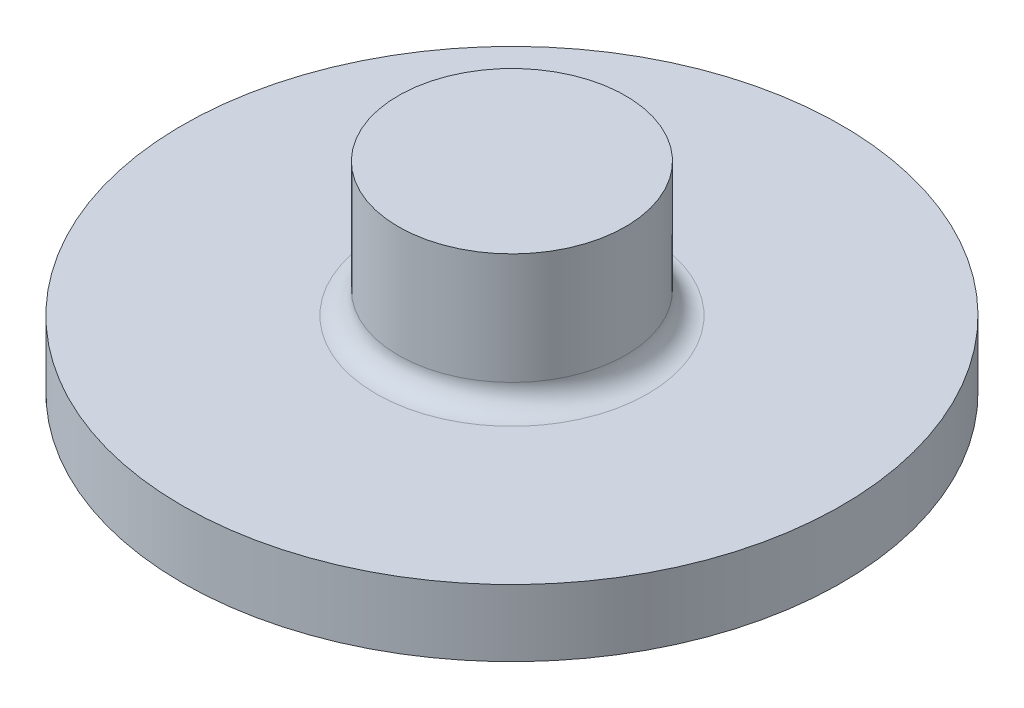
ISO-10303-21;
HEADER;
FILE_DESCRIPTION(('STEP AP214'),'2;1');
FILE_NAME('part.step','',(''),(''),'','','');
FILE_SCHEMA(('AUTOMOTIVE_DESIGN { 1 0 10303 214 1 1 1 1 }'));
ENDSEC;
DATA;
#1=APPLICATION_CONTEXT('core data for automotive mechanical design processes');
#2=APPLICATION_PROTOCOL_DEFINITION('international standard','automotive_design',2000,#1);
#3=PRODUCT_CONTEXT('',#1,'mechanical');
#4=PRODUCT('Part','Part','',(#3));
#5=PRODUCT_RELATED_PRODUCT_CATEGORY('part','',(#4));
#6=PRODUCT_DEFINITION_FORMATION('','',#4);
#7=PRODUCT_DEFINITION_CONTEXT('part definition',#1,'design');
#8=PRODUCT_DEFINITION('design','',#6,#7);
#9=PRODUCT_DEFINITION_SHAPE('','',#8);
#10=(LENGTH_UNIT() NAMED_UNIT(*) SI_UNIT(.MILLI.,.METRE.));
#11=(NAMED_UNIT(*) PLANE_ANGLE_UNIT() SI_UNIT($,.RADIAN.));
#12=(NAMED_UNIT(*) SI_UNIT($,.STERADIAN.) SOLID_ANGLE_UNIT());
#13=UNCERTAINTY_MEASURE_WITH_UNIT(LENGTH_MEASURE(1.E-05),#10,'distance_accuracy_value','');
#14=(GEOMETRIC_REPRESENTATION_CONTEXT(3) GLOBAL_UNCERTAINTY_ASSIGNED_CONTEXT((#13)) GLOBAL_UNIT_ASSIGNED_CONTEXT((#10,
#11,#12)) REPRESENTATION_CONTEXT('',''));
#15=CARTESIAN_POINT('',(0.,0.,0.));
#16=DIRECTION('',(0.,0.,1.));
#17=DIRECTION('',(1.,0.,0.));
#18=AXIS2_PLACEMENT_3D('',#15,#16,#17);
#19=CARTESIAN_POINT('',(0.,1.5,0.));
#20=DIRECTION('',(0.,-1.,0.));
#21=DIRECTION('',(0.,0.,-1.));
#22=AXIS2_PLACEMENT_3D('',#19,#20,#21);
#23=CYLINDRICAL_SURFACE('',#22,7.4);
#24=CARTESIAN_POINT('',(0.,1.5,0.));
#25=DIRECTION('',(0.,1.,0.));
#26=DIRECTION('',(0.,0.,1.));
#27=AXIS2_PLACEMENT_3D('',#24,#25,#26);
#28=CIRCLE('',#27,7.4);
#29=CARTESIAN_POINT('',(0.,1.5,7.4));
#30=VERTEX_POINT('',#29);
#31=EDGE_CURVE('E50',#30,#30,#28,.T.);
#32=ORIENTED_EDGE('',*,*,#31,.F.);
#33=EDGE_LOOP('',(#32));
#34=FACE_BOUND('',#33,.T.);
#35=CARTESIAN_POINT('',(0.,0.,0.));
#36=DIRECTION('',(0.,1.,0.));
#37=DIRECTION('',(0.,0.,1.));
#38=AXIS2_PLACEMENT_3D('',#35,#36,#37);
#39=CIRCLE('',#38,7.4);
#40=CARTESIAN_POINT('',(0.,0.,7.4));
#41=VERTEX_POINT('',#40);
#42=EDGE_CURVE('E55',#41,#41,#39,.T.);
#43=ORIENTED_EDGE('',*,*,#42,.T.);
#44=EDGE_LOOP('',(#43));
#45=FACE_BOUND('',#44,.T.);
#46=ADVANCED_FACE('F37',(#34,#45),#23,.T.);
#47=CARTESIAN_POINT('',(0.,1.5,0.));
#48=DIRECTION('',(0.,1.,0.));
#49=DIRECTION('',(0.,0.,1.));
#50=AXIS2_PLACEMENT_3D('',#47,#48,#49);
#51=PLANE('',#50);
#52=CARTESIAN_POINT('',(0.,1.5,0.));
#53=DIRECTION('',(0.,1.,0.));
#54=DIRECTION('',(0.,0.,1.));
#55=AXIS2_PLACEMENT_3D('',#52,#53,#54);
#56=CIRCLE('',#55,3.05);
#57=CARTESIAN_POINT('',(0.,1.5,3.05));
#58=VERTEX_POINT('',#57);
#59=EDGE_CURVE('E10',#58,#58,#56,.F.);
#60=ORIENTED_EDGE('',*,*,#59,.T.);
#61=EDGE_LOOP('',(#60));
#62=FACE_BOUND('',#61,.T.);
#63=ORIENTED_EDGE('',*,*,#31,.T.);
#64=EDGE_LOOP('',(#63));
#65=FACE_BOUND('',#64,.T.);
#66=ADVANCED_FACE('F77',(#62,#65),#51,.T.);
#67=CARTESIAN_POINT('',(0.,0.,0.));
#68=DIRECTION('',(0.,1.,0.));
#69=DIRECTION('',(0.,0.,1.));
#70=AXIS2_PLACEMENT_3D('',#67,#68,#69);
#71=PLANE('',#70);
#72=ORIENTED_EDGE('',*,*,#42,.F.);
#73=EDGE_LOOP('',(#72));
#74=FACE_BOUND('',#73,.T.);
#75=ADVANCED_FACE('F70',(#74),#71,.F.);
#76=CARTESIAN_POINT('',(0.,4.5,0.));
#77=DIRECTION('',(0.,-1.,0.));
#78=DIRECTION('',(0.,0.,-1.));
#79=AXIS2_PLACEMENT_3D('',#76,#77,#78);
#80=CYLINDRICAL_SURFACE('',#79,2.55);
#81=CARTESIAN_POINT('',(0.,2.,0.));
#82=DIRECTION('',(0.,1.,0.));
#83=DIRECTION('',(0.,0.,1.));
#84=AXIS2_PLACEMENT_3D('',#81,#82,#83);
#85=CIRCLE('',#84,2.55);
#86=CARTESIAN_POINT('',(0.,2.,2.55));
#87=VERTEX_POINT('',#86);
#88=EDGE_CURVE('E45',#87,#87,#85,.T.);
#89=ORIENTED_EDGE('',*,*,#88,.T.);
#90=EDGE_LOOP('',(#89));
#91=FACE_BOUND('',#90,.T.);
#92=CARTESIAN_POINT('',(0.,4.5,0.));
#93=DIRECTION('',(0.,1.,0.));
#94=DIRECTION('',(0.,0.,1.));
#95=AXIS2_PLACEMENT_3D('',#92,#93,#94);
#96=CIRCLE('',#95,2.55);
#97=CARTESIAN_POINT('',(0.,4.5,2.55));
#98=VERTEX_POINT('',#97);
#99=EDGE_CURVE('E60',#98,#98,#96,.T.);
#100=ORIENTED_EDGE('',*,*,#99,.F.);
#101=EDGE_LOOP('',(#100));
#102=FACE_BOUND('',#101,.T.);
#103=ADVANCED_FACE('F68',(#91,#102),#80,.T.);
#104=CARTESIAN_POINT('',(0.,4.5,0.));
#105=DIRECTION('',(0.,1.,0.));
#106=DIRECTION('',(0.,0.,1.));
#107=AXIS2_PLACEMENT_3D('',#104,#105,#106);
#108=PLANE('',#107);
#109=ORIENTED_EDGE('',*,*,#99,.T.);
#110=EDGE_LOOP('',(#109));
#111=FACE_BOUND('',#110,.T.);
#112=ADVANCED_FACE('F66',(#111),#108,.T.);
#113=CARTESIAN_POINT('',(0.,2.,0.));
#114=DIRECTION('',(0.,1.,0.));
#115=DIRECTION('',(0.,0.,1.));
#116=AXIS2_PLACEMENT_3D('',#113,#114,#115);
#117=TOROIDAL_SURFACE('',#116,3.05,0.5);
#118=ORIENTED_EDGE('',*,*,#59,.F.);
#119=EDGE_LOOP('',(#118));
#120=FACE_BOUND('',#119,.T.);
#121=ORIENTED_EDGE('',*,*,#88,.F.);
#122=EDGE_LOOP('',(#121));
#123=FACE_BOUND('',#122,.T.);
#124=ADVANCED_FACE('F39',(#120,#123),#117,.F.);
#125=CLOSED_SHELL('',(#46,#66,#75,#103,#112,#124));
#126=MANIFOLD_SOLID_BREP('B2',#125);
#127=ADVANCED_BREP_SHAPE_REPRESENTATION('',(#18,#126),#14);
#128=SHAPE_DEFINITION_REPRESENTATION(#9,#127);
ENDSEC;
END-ISO-10303-21;
